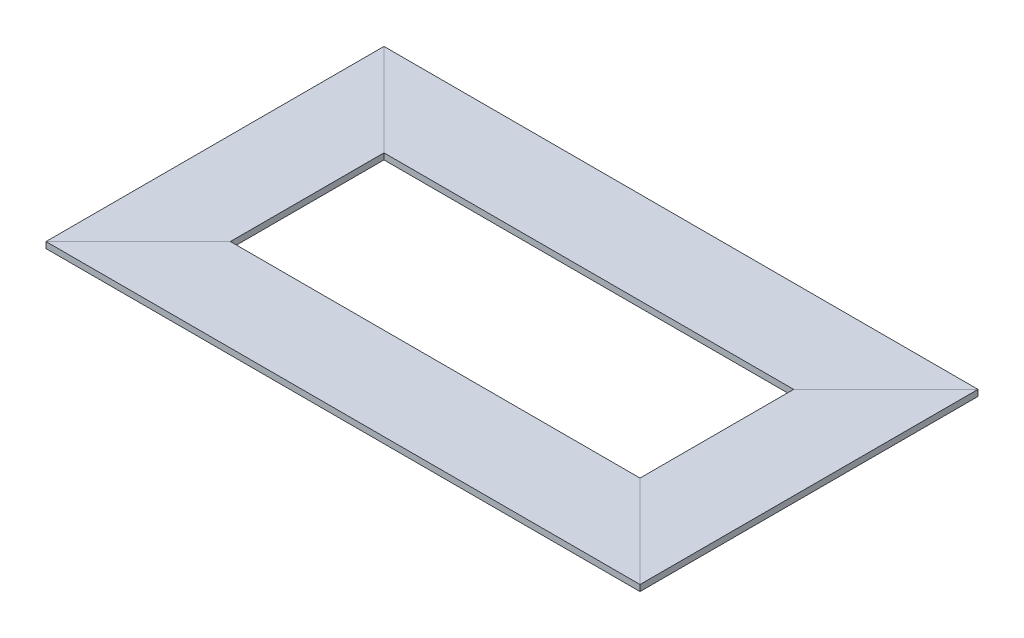
ISO-10303-21;
HEADER;
FILE_DESCRIPTION(('STEP AP214'),'2;1');
FILE_NAME('part.step','',(''),(''),'','','');
FILE_SCHEMA(('AUTOMOTIVE_DESIGN { 1 0 10303 214 1 1 1 1 }'));
ENDSEC;
DATA;
#1=APPLICATION_CONTEXT('core data for automotive mechanical design processes');
#2=APPLICATION_PROTOCOL_DEFINITION('international standard','automotive_design',2000,#1);
#3=PRODUCT_CONTEXT('',#1,'mechanical');
#4=PRODUCT('Part','Part','',(#3));
#5=PRODUCT_RELATED_PRODUCT_CATEGORY('part','',(#4));
#6=PRODUCT_DEFINITION_FORMATION('','',#4);
#7=PRODUCT_DEFINITION_CONTEXT('part definition',#1,'design');
#8=PRODUCT_DEFINITION('design','',#6,#7);
#9=PRODUCT_DEFINITION_SHAPE('','',#8);
#10=(LENGTH_UNIT() NAMED_UNIT(*) SI_UNIT(.MILLI.,.METRE.));
#11=(NAMED_UNIT(*) PLANE_ANGLE_UNIT() SI_UNIT($,.RADIAN.));
#12=(NAMED_UNIT(*) SI_UNIT($,.STERADIAN.) SOLID_ANGLE_UNIT());
#13=UNCERTAINTY_MEASURE_WITH_UNIT(LENGTH_MEASURE(1.E-05),#10,'distance_accuracy_value','');
#14=(GEOMETRIC_REPRESENTATION_CONTEXT(3) GLOBAL_UNCERTAINTY_ASSIGNED_CONTEXT((#13)) GLOBAL_UNIT_ASSIGNED_CONTEXT((#10,
#11,#12)) REPRESENTATION_CONTEXT('',''));
#15=CARTESIAN_POINT('',(0.,0.,0.));
#16=DIRECTION('',(0.,0.,1.));
#17=DIRECTION('',(1.,0.,0.));
#18=AXIS2_PLACEMENT_3D('',#15,#16,#17);
#19=CARTESIAN_POINT('',(98.,0.71296145830337,-49.9));
#20=DIRECTION('',(0.,1.,0.));
#21=DIRECTION('',(-1.,0.,0.));
#22=AXIS2_PLACEMENT_3D('',#19,#20,#21);
#23=PLANE('',#22);
#24=DIRECTION('',(0.,0.,1.));
#25=VECTOR('',#24,1.);
#26=CARTESIAN_POINT('',(93.3642700046298,0.71296145830337,-49.9));
#27=LINE('',#26,#25);
#28=CARTESIAN_POINT('',(93.3642700046298,0.71296145830337,-43.3642700046298));
#29=VERTEX_POINT('',#28);
#30=CARTESIAN_POINT('',(93.3642700046298,0.71296145830337,13.3642700046298));
#31=VERTEX_POINT('',#30);
#32=EDGE_CURVE('E45',#29,#31,#27,.T.);
#33=ORIENTED_EDGE('',*,*,#32,.F.);
#34=DIRECTION('',(0.707106781186547,0.,-0.707106781186548));
#35=VECTOR('',#34,1.);
#36=CARTESIAN_POINT('',(39.05,0.712961458303368,10.95));
#37=LINE('',#36,#35);
#38=CARTESIAN_POINT('',(98.,0.71296145830337,-48.));
#39=VERTEX_POINT('',#38);
#40=EDGE_CURVE('E216',#29,#39,#37,.T.);
#41=ORIENTED_EDGE('',*,*,#40,.T.);
#42=DIRECTION('',(0.,0.,1.));
#43=VECTOR('',#42,1.);
#44=CARTESIAN_POINT('',(98.,0.71296145830337,-49.9));
#45=LINE('',#44,#43);
#46=CARTESIAN_POINT('',(98.,0.71296145830337,18.));
#47=VERTEX_POINT('',#46);
#48=EDGE_CURVE('E146',#39,#47,#45,.T.);
#49=ORIENTED_EDGE('',*,*,#48,.T.);
#50=DIRECTION('',(0.707106781186548,0.,0.707106781186547));
#51=VECTOR('',#50,1.);
#52=CARTESIAN_POINT('',(98.95,0.71296145830337,18.95));
#53=LINE('',#52,#51);
#54=EDGE_CURVE('E133',#31,#47,#53,.T.);
#55=ORIENTED_EDGE('',*,*,#54,.F.);
#56=EDGE_LOOP('',(#33,#41,#49,#55));
#57=FACE_BOUND('',#56,.T.);
#58=ADVANCED_FACE('F39',(#57),#23,.F.);
#59=CARTESIAN_POINT('',(98.,1.91296145830337,-49.9));
#60=DIRECTION('',(-1.,0.,0.));
#61=DIRECTION('',(0.,0.,1.));
#62=AXIS2_PLACEMENT_3D('',#59,#60,#61);
#63=PLANE('',#62);
#64=ORIENTED_EDGE('',*,*,#48,.F.);
#65=DIRECTION('',(0.,1.,0.));
#66=VECTOR('',#65,1.);
#67=CARTESIAN_POINT('',(98.,1.91296145830337,-48.));
#68=LINE('',#67,#66);
#69=CARTESIAN_POINT('',(98.,1.91296145830337,-48.));
#70=VERTEX_POINT('',#69);
#71=EDGE_CURVE('E288',#39,#70,#68,.T.);
#72=ORIENTED_EDGE('',*,*,#71,.T.);
#73=DIRECTION('',(0.,0.,1.));
#74=VECTOR('',#73,1.);
#75=CARTESIAN_POINT('',(98.,1.91296145830337,-49.9));
#76=LINE('',#75,#74);
#77=CARTESIAN_POINT('',(98.,1.91296145830337,18.));
#78=VERTEX_POINT('',#77);
#79=EDGE_CURVE('E169',#70,#78,#76,.T.);
#80=ORIENTED_EDGE('',*,*,#79,.T.);
#81=DIRECTION('',(0.,1.,0.));
#82=VECTOR('',#81,1.);
#83=CARTESIAN_POINT('',(98.,1.91296145830337,18.));
#84=LINE('',#83,#82);
#85=EDGE_CURVE('E155',#47,#78,#84,.T.);
#86=ORIENTED_EDGE('',*,*,#85,.F.);
#87=EDGE_LOOP('',(#64,#72,#80,#86));
#88=FACE_BOUND('',#87,.T.);
#89=ADVANCED_FACE('F422',(#88),#63,.F.);
#90=CARTESIAN_POINT('',(98.,1.91296145830337,-49.9));
#91=DIRECTION('',(0.,-1.,0.));
#92=DIRECTION('',(0.,0.,-1.));
#93=AXIS2_PLACEMENT_3D('',#90,#91,#92);
#94=PLANE('',#93);
#95=ORIENTED_EDGE('',*,*,#79,.F.);
#96=DIRECTION('',(-0.707106781186547,0.,0.707106781186548));
#97=VECTOR('',#96,1.);
#98=CARTESIAN_POINT('',(39.05,1.91296145830337,10.95));
#99=LINE('',#98,#97);
#100=CARTESIAN_POINT('',(80.,1.91296145830337,-30.));
#101=VERTEX_POINT('',#100);
#102=EDGE_CURVE('E286',#70,#101,#99,.T.);
#103=ORIENTED_EDGE('',*,*,#102,.T.);
#104=DIRECTION('',(0.,0.,1.));
#105=VECTOR('',#104,1.);
#106=CARTESIAN_POINT('',(80.,1.91296145830337,-49.9));
#107=LINE('',#106,#105);
#108=CARTESIAN_POINT('',(80.,1.91296145830337,0.));
#109=VERTEX_POINT('',#108);
#110=EDGE_CURVE('E172',#101,#109,#107,.T.);
#111=ORIENTED_EDGE('',*,*,#110,.T.);
#112=DIRECTION('',(-0.707106781186548,0.,-0.707106781186547));
#113=VECTOR('',#112,1.);
#114=CARTESIAN_POINT('',(98.95,1.91296145830337,18.95));
#115=LINE('',#114,#113);
#116=EDGE_CURVE('E227',#78,#109,#115,.T.);
#117=ORIENTED_EDGE('',*,*,#116,.F.);
#118=EDGE_LOOP('',(#95,#103,#111,#117));
#119=FACE_BOUND('',#118,.T.);
#120=ADVANCED_FACE('F421',(#119),#94,.F.);
#121=CARTESIAN_POINT('',(80.,1.91296145830337,-49.9));
#122=DIRECTION('',(1.,0.,0.));
#123=DIRECTION('',(0.,0.,-1.));
#124=AXIS2_PLACEMENT_3D('',#121,#122,#123);
#125=PLANE('',#124);
#126=ORIENTED_EDGE('',*,*,#110,.F.);
#127=DIRECTION('',(0.,-1.,0.));
#128=VECTOR('',#127,1.);
#129=CARTESIAN_POINT('',(80.,1.91296145830336,-30.));
#130=LINE('',#129,#128);
#131=CARTESIAN_POINT('',(80.,0.71296145830337,-30.));
#132=VERTEX_POINT('',#131);
#133=EDGE_CURVE('E284',#101,#132,#130,.T.);
#134=ORIENTED_EDGE('',*,*,#133,.T.);
#135=DIRECTION('',(0.,0.,1.));
#136=VECTOR('',#135,1.);
#137=CARTESIAN_POINT('',(80.,0.71296145830337,-49.9));
#138=LINE('',#137,#136);
#139=CARTESIAN_POINT('',(80.,0.71296145830337,0.));
#140=VERTEX_POINT('',#139);
#141=EDGE_CURVE('E171',#132,#140,#138,.T.);
#142=ORIENTED_EDGE('',*,*,#141,.T.);
#143=DIRECTION('',(0.,-1.,0.));
#144=VECTOR('',#143,1.);
#145=CARTESIAN_POINT('',(80.,1.91296145830337,0.));
#146=LINE('',#145,#144);
#147=EDGE_CURVE('E221',#109,#140,#146,.T.);
#148=ORIENTED_EDGE('',*,*,#147,.F.);
#149=EDGE_LOOP('',(#126,#134,#142,#148));
#150=FACE_BOUND('',#149,.T.);
#151=ADVANCED_FACE('F431',(#150),#125,.F.);
#152=CARTESIAN_POINT('',(80.,0.71296145830337,-49.9));
#153=DIRECTION('',(0.,1.,0.));
#154=DIRECTION('',(0.,0.,1.));
#155=AXIS2_PLACEMENT_3D('',#152,#153,#154);
#156=PLANE('',#155);
#157=ORIENTED_EDGE('',*,*,#141,.F.);
#158=DIRECTION('',(0.707106781186547,0.,-0.707106781186548));
#159=VECTOR('',#158,1.);
#160=CARTESIAN_POINT('',(30.05,0.71296145830337,19.95));
#161=LINE('',#160,#159);
#162=CARTESIAN_POINT('',(83.8572987406945,0.71296145830337,-33.8572987406945));
#163=VERTEX_POINT('',#162);
#164=EDGE_CURVE('E278',#132,#163,#161,.T.);
#165=ORIENTED_EDGE('',*,*,#164,.T.);
#166=DIRECTION('',(0.,0.,1.));
#167=VECTOR('',#166,1.);
#168=CARTESIAN_POINT('',(83.8572987406945,0.71296145830337,-49.9));
#169=LINE('',#168,#167);
#170=CARTESIAN_POINT('',(83.8572987406945,0.71296145830337,3.85729874069453));
#171=VERTEX_POINT('',#170);
#172=EDGE_CURVE('E177',#163,#171,#169,.T.);
#173=ORIENTED_EDGE('',*,*,#172,.T.);
#174=DIRECTION('',(0.707106781186548,0.,0.707106781186547));
#175=VECTOR('',#174,1.);
#176=CARTESIAN_POINT('',(89.95,0.71296145830337,9.95000000000002));
#177=LINE('',#176,#175);
#178=EDGE_CURVE('E225',#140,#171,#177,.T.);
#179=ORIENTED_EDGE('',*,*,#178,.F.);
#180=EDGE_LOOP('',(#157,#165,#173,#179));
#181=FACE_BOUND('',#180,.T.);
#182=ADVANCED_FACE('F505',(#181),#156,.F.);
#183=CARTESIAN_POINT('',(87.,0.712961458303367,-49.9));
#184=DIRECTION('',(0.,1.,0.));
#185=DIRECTION('',(-1.,0.,0.));
#186=AXIS2_PLACEMENT_3D('',#183,#184,#185);
#187=PLANE('',#186);
#188=ORIENTED_EDGE('',*,*,#172,.F.);
#189=DIRECTION('',(0.707106781186547,0.,-0.707106781186548));
#190=VECTOR('',#189,1.);
#191=CARTESIAN_POINT('',(33.55,0.71296145830341,16.45));
#192=LINE('',#191,#190);
#193=CARTESIAN_POINT('',(87.,0.712961458303367,-37.));
#194=VERTEX_POINT('',#193);
#195=EDGE_CURVE('E280',#163,#194,#192,.T.);
#196=ORIENTED_EDGE('',*,*,#195,.T.);
#197=DIRECTION('',(0.,0.,1.));
#198=VECTOR('',#197,1.);
#199=CARTESIAN_POINT('',(87.,0.712961458303367,-49.9));
#200=LINE('',#199,#198);
#201=CARTESIAN_POINT('',(87.,0.712961458303367,7.));
#202=VERTEX_POINT('',#201);
#203=EDGE_CURVE('E180',#194,#202,#200,.T.);
#204=ORIENTED_EDGE('',*,*,#203,.T.);
#205=DIRECTION('',(0.707106781186548,0.,0.707106781186547));
#206=VECTOR('',#205,1.);
#207=CARTESIAN_POINT('',(93.45,0.712961458303362,13.45));
#208=LINE('',#207,#206);
#209=EDGE_CURVE('E219',#171,#202,#208,.T.);
#210=ORIENTED_EDGE('',*,*,#209,.F.);
#211=EDGE_LOOP('',(#188,#196,#204,#210));
#212=FACE_BOUND('',#211,.T.);
#213=ADVANCED_FACE('F499',(#212),#187,.F.);
#214=CARTESIAN_POINT('',(87.,-2.28703854169663,-49.9));
#215=DIRECTION('',(1.,0.,0.));
#216=DIRECTION('',(0.,0.,-1.));
#217=AXIS2_PLACEMENT_3D('',#214,#215,#216);
#218=PLANE('',#217);
#219=ORIENTED_EDGE('',*,*,#203,.F.);
#220=DIRECTION('',(0.,-1.,0.));
#221=VECTOR('',#220,1.);
#222=CARTESIAN_POINT('',(87.,-2.28703854169663,-37.));
#223=LINE('',#222,#221);
#224=CARTESIAN_POINT('',(87.,-2.28703854169663,-37.));
#225=VERTEX_POINT('',#224);
#226=EDGE_CURVE('E197',#194,#225,#223,.T.);
#227=ORIENTED_EDGE('',*,*,#226,.T.);
#228=DIRECTION('',(0.,0.,1.));
#229=VECTOR('',#228,1.);
#230=CARTESIAN_POINT('',(87.,-2.28703854169663,-49.9));
#231=LINE('',#230,#229);
#232=CARTESIAN_POINT('',(87.,-2.28703854169663,7.));
#233=VERTEX_POINT('',#232);
#234=EDGE_CURVE('E181',#225,#233,#231,.T.);
#235=ORIENTED_EDGE('',*,*,#234,.T.);
#236=DIRECTION('',(0.,-1.,0.));
#237=VECTOR('',#236,1.);
#238=CARTESIAN_POINT('',(87.,-2.28703854169663,7.));
#239=LINE('',#238,#237);
#240=EDGE_CURVE('E120',#202,#233,#239,.T.);
#241=ORIENTED_EDGE('',*,*,#240,.F.);
#242=EDGE_LOOP('',(#219,#227,#235,#241));
#243=FACE_BOUND('',#242,.T.);
#244=ADVANCED_FACE('F494',(#243),#218,.F.);
#245=CARTESIAN_POINT('',(93.3642700046298,-2.28703854169663,-49.9));
#246=DIRECTION('',(0.,1.,0.));
#247=DIRECTION('',(0.,0.,1.));
#248=AXIS2_PLACEMENT_3D('',#245,#246,#247);
#249=PLANE('',#248);
#250=ORIENTED_EDGE('',*,*,#234,.F.);
#251=DIRECTION('',(0.707106781186547,0.,-0.707106781186548));
#252=VECTOR('',#251,1.);
#253=CARTESIAN_POINT('',(36.7321350023149,-2.28703854169663,13.2678649976851));
#254=LINE('',#253,#252);
#255=CARTESIAN_POINT('',(93.3642700046298,-2.28703854169663,-43.3642700046298));
#256=VERTEX_POINT('',#255);
#257=EDGE_CURVE('E192',#225,#256,#254,.T.);
#258=ORIENTED_EDGE('',*,*,#257,.T.);
#259=DIRECTION('',(0.,0.,1.));
#260=VECTOR('',#259,1.);
#261=CARTESIAN_POINT('',(93.3642700046298,-2.28703854169663,-49.9));
#262=LINE('',#261,#260);
#263=CARTESIAN_POINT('',(93.3642700046298,-2.28703854169663,13.3642700046298));
#264=VERTEX_POINT('',#263);
#265=EDGE_CURVE('E144',#256,#264,#262,.T.);
#266=ORIENTED_EDGE('',*,*,#265,.T.);
#267=DIRECTION('',(0.707106781186548,0.,0.707106781186547));
#268=VECTOR('',#267,1.);
#269=CARTESIAN_POINT('',(96.632135002315,-2.28703854169663,16.6321350023149));
#270=LINE('',#269,#268);
#271=EDGE_CURVE('E188',#233,#264,#270,.T.);
#272=ORIENTED_EDGE('',*,*,#271,.F.);
#273=EDGE_LOOP('',(#250,#258,#266,#272));
#274=FACE_BOUND('',#273,.T.);
#275=ADVANCED_FACE('F186',(#274),#249,.F.);
#276=CARTESIAN_POINT('',(93.3642700046298,0.71296145830337,-49.9));
#277=DIRECTION('',(-1.,0.,0.));
#278=DIRECTION('',(0.,-1.,0.));
#279=AXIS2_PLACEMENT_3D('',#276,#277,#278);
#280=PLANE('',#279);
#281=ORIENTED_EDGE('',*,*,#265,.F.);
#282=DIRECTION('',(0.,1.,0.));
#283=VECTOR('',#282,1.);
#284=CARTESIAN_POINT('',(93.3642700046298,0.712961458303304,-43.3642700046298));
#285=LINE('',#284,#283);
#286=EDGE_CURVE('E143',#256,#29,#285,.T.);
#287=ORIENTED_EDGE('',*,*,#286,.T.);
#288=ORIENTED_EDGE('',*,*,#32,.T.);
#289=DIRECTION('',(0.,1.,0.));
#290=VECTOR('',#289,1.);
#291=CARTESIAN_POINT('',(93.3642700046298,0.712961458303374,13.3642700046298));
#292=LINE('',#291,#290);
#293=EDGE_CURVE('E123',#264,#31,#292,.T.);
#294=ORIENTED_EDGE('',*,*,#293,.F.);
#295=EDGE_LOOP('',(#281,#287,#288,#294));
#296=FACE_BOUND('',#295,.T.);
#297=ADVANCED_FACE('F140',(#296),#280,.F.);
#298=CARTESIAN_POINT('',(99.9,0.71296145830337,18.));
#299=DIRECTION('',(0.,1.,0.));
#300=DIRECTION('',(0.,0.,1.));
#301=AXIS2_PLACEMENT_3D('',#298,#299,#300);
#302=PLANE('',#301);
#303=DIRECTION('',(-1.,0.,0.));
#304=VECTOR('',#303,1.);
#305=CARTESIAN_POINT('',(99.9,0.71296145830337,13.3642700046298));
#306=LINE('',#305,#304);
#307=CARTESIAN_POINT('',(-13.3642700046298,0.71296145830337,13.3642700046298));
#308=VERTEX_POINT('',#307);
#309=EDGE_CURVE('E129',#31,#308,#306,.T.);
#310=ORIENTED_EDGE('',*,*,#309,.F.);
#311=ORIENTED_EDGE('',*,*,#54,.T.);
#312=DIRECTION('',(-1.,0.,0.));
#313=VECTOR('',#312,1.);
#314=CARTESIAN_POINT('',(99.9,0.71296145830337,18.));
#315=LINE('',#314,#313);
#316=CARTESIAN_POINT('',(-18.,0.71296145830337,18.));
#317=VERTEX_POINT('',#316);
#318=EDGE_CURVE('E217',#47,#317,#315,.T.);
#319=ORIENTED_EDGE('',*,*,#318,.T.);
#320=DIRECTION('',(-0.707106781186547,0.,0.707106781186548));
#321=VECTOR('',#320,1.);
#322=CARTESIAN_POINT('',(-18.95,0.71296145830337,18.95));
#323=LINE('',#322,#321);
#324=EDGE_CURVE('E156',#308,#317,#323,.T.);
#325=ORIENTED_EDGE('',*,*,#324,.F.);
#326=EDGE_LOOP('',(#310,#311,#319,#325));
#327=FACE_BOUND('',#326,.T.);
#328=ADVANCED_FACE('F152',(#327),#302,.F.);
#329=CARTESIAN_POINT('',(99.9,1.91296145830337,18.));
#330=DIRECTION('',(0.,0.,-1.));
#331=DIRECTION('',(-1.,0.,0.));
#332=AXIS2_PLACEMENT_3D('',#329,#330,#331);
#333=PLANE('',#332);
#334=ORIENTED_EDGE('',*,*,#318,.F.);
#335=ORIENTED_EDGE('',*,*,#85,.T.);
#336=DIRECTION('',(-1.,0.,0.));
#337=VECTOR('',#336,1.);
#338=CARTESIAN_POINT('',(99.9,1.91296145830337,18.));
#339=LINE('',#338,#337);
#340=CARTESIAN_POINT('',(-18.,1.91296145830337,18.));
#341=VERTEX_POINT('',#340);
#342=EDGE_CURVE('E228',#78,#341,#339,.T.);
#343=ORIENTED_EDGE('',*,*,#342,.T.);
#344=DIRECTION('',(0.,1.,0.));
#345=VECTOR('',#344,1.);
#346=CARTESIAN_POINT('',(-18.,1.91296145830337,18.));
#347=LINE('',#346,#345);
#348=EDGE_CURVE('E397',#317,#341,#347,.T.);
#349=ORIENTED_EDGE('',*,*,#348,.F.);
#350=EDGE_LOOP('',(#334,#335,#343,#349));
#351=FACE_BOUND('',#350,.T.);
#352=ADVANCED_FACE('F401',(#351),#333,.F.);
#353=CARTESIAN_POINT('',(99.9,1.91296145830337,18.));
#354=DIRECTION('',(0.,-1.,0.));
#355=DIRECTION('',(0.,0.,-1.));
#356=AXIS2_PLACEMENT_3D('',#353,#354,#355);
#357=PLANE('',#356);
#358=ORIENTED_EDGE('',*,*,#342,.F.);
#359=ORIENTED_EDGE('',*,*,#116,.T.);
#360=DIRECTION('',(-1.,0.,0.));
#361=VECTOR('',#360,1.);
#362=CARTESIAN_POINT('',(99.9000000000001,1.91296145830337,0.));
#363=LINE('',#362,#361);
#364=CARTESIAN_POINT('',(0.,1.91296145830337,0.));
#365=VERTEX_POINT('',#364);
#366=EDGE_CURVE('E234',#109,#365,#363,.T.);
#367=ORIENTED_EDGE('',*,*,#366,.T.);
#368=DIRECTION('',(0.707106781186547,0.,-0.707106781186548));
#369=VECTOR('',#368,1.);
#370=CARTESIAN_POINT('',(-18.95,1.91296145830337,18.95));
#371=LINE('',#370,#369);
#372=EDGE_CURVE('E400',#341,#365,#371,.T.);
#373=ORIENTED_EDGE('',*,*,#372,.F.);
#374=EDGE_LOOP('',(#358,#359,#367,#373));
#375=FACE_BOUND('',#374,.T.);
#376=ADVANCED_FACE('F403',(#375),#357,.F.);
#377=CARTESIAN_POINT('',(99.9000000000001,1.91296145830337,0.));
#378=DIRECTION('',(0.,0.,1.));
#379=DIRECTION('',(0.,-1.,0.));
#380=AXIS2_PLACEMENT_3D('',#377,#378,#379);
#381=PLANE('',#380);
#382=ORIENTED_EDGE('',*,*,#366,.F.);
#383=ORIENTED_EDGE('',*,*,#147,.T.);
#384=DIRECTION('',(-1.,0.,0.));
#385=VECTOR('',#384,1.);
#386=CARTESIAN_POINT('',(99.9000000000001,0.71296145830337,0.));
#387=LINE('',#386,#385);
#388=CARTESIAN_POINT('',(0.,0.71296145830337,0.));
#389=VERTEX_POINT('',#388);
#390=EDGE_CURVE('E237',#140,#389,#387,.T.);
#391=ORIENTED_EDGE('',*,*,#390,.T.);
#392=DIRECTION('',(0.,-1.,0.));
#393=VECTOR('',#392,1.);
#394=CARTESIAN_POINT('',(0.,1.91296145830337,0.));
#395=LINE('',#394,#393);
#396=EDGE_CURVE('E406',#365,#389,#395,.T.);
#397=ORIENTED_EDGE('',*,*,#396,.F.);
#398=EDGE_LOOP('',(#382,#383,#391,#397));
#399=FACE_BOUND('',#398,.T.);
#400=ADVANCED_FACE('F477',(#399),#381,.F.);
#401=CARTESIAN_POINT('',(99.9000000000001,0.71296145830337,0.));
#402=DIRECTION('',(0.,1.,0.));
#403=DIRECTION('',(0.,0.,1.));
#404=AXIS2_PLACEMENT_3D('',#401,#402,#403);
#405=PLANE('',#404);
#406=ORIENTED_EDGE('',*,*,#390,.F.);
#407=ORIENTED_EDGE('',*,*,#178,.T.);
#408=DIRECTION('',(-1.,0.,0.));
#409=VECTOR('',#408,1.);
#410=CARTESIAN_POINT('',(99.9000000000001,0.71296145830337,3.85729874069453));
#411=LINE('',#410,#409);
#412=CARTESIAN_POINT('',(-3.85729874069453,0.71296145830337,3.85729874069453));
#413=VERTEX_POINT('',#412);
#414=EDGE_CURVE('E239',#171,#413,#411,.T.);
#415=ORIENTED_EDGE('',*,*,#414,.T.);
#416=DIRECTION('',(-0.707106781186547,0.,0.707106781186548));
#417=VECTOR('',#416,1.);
#418=CARTESIAN_POINT('',(-9.94999999999999,0.71296145830337,9.95));
#419=LINE('',#418,#417);
#420=EDGE_CURVE('E379',#389,#413,#419,.T.);
#421=ORIENTED_EDGE('',*,*,#420,.F.);
#422=EDGE_LOOP('',(#406,#407,#415,#421));
#423=FACE_BOUND('',#422,.T.);
#424=ADVANCED_FACE('F478',(#423),#405,.F.);
#425=CARTESIAN_POINT('',(99.9,0.712961458303367,7.));
#426=DIRECTION('',(0.,1.,0.));
#427=DIRECTION('',(0.,0.,1.));
#428=AXIS2_PLACEMENT_3D('',#425,#426,#427);
#429=PLANE('',#428);
#430=ORIENTED_EDGE('',*,*,#414,.F.);
#431=ORIENTED_EDGE('',*,*,#209,.T.);
#432=DIRECTION('',(-1.,0.,0.));
#433=VECTOR('',#432,1.);
#434=CARTESIAN_POINT('',(99.9,0.712961458303367,7.));
#435=LINE('',#434,#433);
#436=CARTESIAN_POINT('',(-6.99999999999999,0.712961458303367,7.));
#437=VERTEX_POINT('',#436);
#438=EDGE_CURVE('E245',#202,#437,#435,.T.);
#439=ORIENTED_EDGE('',*,*,#438,.T.);
#440=DIRECTION('',(-0.707106781186547,0.,0.707106781186548));
#441=VECTOR('',#440,1.);
#442=CARTESIAN_POINT('',(-13.45,0.712961458303362,13.45));
#443=LINE('',#442,#441);
#444=EDGE_CURVE('E384',#413,#437,#443,.T.);
#445=ORIENTED_EDGE('',*,*,#444,.F.);
#446=EDGE_LOOP('',(#430,#431,#439,#445));
#447=FACE_BOUND('',#446,.T.);
#448=ADVANCED_FACE('F471',(#447),#429,.F.);
#449=CARTESIAN_POINT('',(99.9,-2.28703854169663,7.));
#450=DIRECTION('',(0.,0.,1.));
#451=DIRECTION('',(1.,0.,0.));
#452=AXIS2_PLACEMENT_3D('',#449,#450,#451);
#453=PLANE('',#452);
#454=ORIENTED_EDGE('',*,*,#438,.F.);
#455=ORIENTED_EDGE('',*,*,#240,.T.);
#456=DIRECTION('',(-1.,0.,0.));
#457=VECTOR('',#456,1.);
#458=CARTESIAN_POINT('',(99.9,-2.28703854169663,7.));
#459=LINE('',#458,#457);
#460=CARTESIAN_POINT('',(-6.99999999999999,-2.28703854169663,7.));
#461=VERTEX_POINT('',#460);
#462=EDGE_CURVE('E162',#233,#461,#459,.T.);
#463=ORIENTED_EDGE('',*,*,#462,.T.);
#464=DIRECTION('',(0.,-1.,0.));
#465=VECTOR('',#464,1.);
#466=CARTESIAN_POINT('',(-6.99999999999999,-2.28703854169663,7.));
#467=LINE('',#466,#465);
#468=EDGE_CURVE('E250',#437,#461,#467,.T.);
#469=ORIENTED_EDGE('',*,*,#468,.F.);
#470=EDGE_LOOP('',(#454,#455,#463,#469));
#471=FACE_BOUND('',#470,.T.);
#472=ADVANCED_FACE('F247',(#471),#453,.F.);
#473=CARTESIAN_POINT('',(99.9,-2.28703854169663,13.3642700046298));
#474=DIRECTION('',(0.,1.,0.));
#475=DIRECTION('',(0.,0.,1.));
#476=AXIS2_PLACEMENT_3D('',#473,#474,#475);
#477=PLANE('',#476);
#478=ORIENTED_EDGE('',*,*,#462,.F.);
#479=ORIENTED_EDGE('',*,*,#271,.T.);
#480=DIRECTION('',(-1.,0.,0.));
#481=VECTOR('',#480,1.);
#482=CARTESIAN_POINT('',(99.9,-2.28703854169663,13.3642700046298));
#483=LINE('',#482,#481);
#484=CARTESIAN_POINT('',(-13.3642700046298,-2.28703854169663,13.3642700046298));
#485=VERTEX_POINT('',#484);
#486=EDGE_CURVE('E135',#264,#485,#483,.T.);
#487=ORIENTED_EDGE('',*,*,#486,.T.);
#488=DIRECTION('',(-0.707106781186547,0.,0.707106781186548));
#489=VECTOR('',#488,1.);
#490=CARTESIAN_POINT('',(-16.6321350023149,-2.28703854169663,16.6321350023149));
#491=LINE('',#490,#489);
#492=EDGE_CURVE('E258',#461,#485,#491,.T.);
#493=ORIENTED_EDGE('',*,*,#492,.F.);
#494=EDGE_LOOP('',(#478,#479,#487,#493));
#495=FACE_BOUND('',#494,.T.);
#496=ADVANCED_FACE('F256',(#495),#477,.F.);
#497=CARTESIAN_POINT('',(99.9,0.71296145830337,13.3642700046298));
#498=DIRECTION('',(0.,0.,-1.));
#499=DIRECTION('',(0.,1.,0.));
#500=AXIS2_PLACEMENT_3D('',#497,#498,#499);
#501=PLANE('',#500);
#502=ORIENTED_EDGE('',*,*,#486,.F.);
#503=ORIENTED_EDGE('',*,*,#293,.T.);
#504=ORIENTED_EDGE('',*,*,#309,.T.);
#505=DIRECTION('',(0.,1.,0.));
#506=VECTOR('',#505,1.);
#507=CARTESIAN_POINT('',(-13.3642700046298,0.712961458303374,13.3642700046298));
#508=LINE('',#507,#506);
#509=EDGE_CURVE('E257',#485,#308,#508,.T.);
#510=ORIENTED_EDGE('',*,*,#509,.F.);
#511=EDGE_LOOP('',(#502,#503,#504,#510));
#512=FACE_BOUND('',#511,.T.);
#513=ADVANCED_FACE('F127',(#512),#501,.F.);
#514=CARTESIAN_POINT('',(-19.9000000000001,0.71296145830337,-48.));
#515=DIRECTION('',(0.,1.,0.));
#516=DIRECTION('',(0.,0.,1.));
#517=AXIS2_PLACEMENT_3D('',#514,#515,#516);
#518=PLANE('',#517);
#519=DIRECTION('',(1.,0.,0.));
#520=VECTOR('',#519,1.);
#521=CARTESIAN_POINT('',(-19.9000000000001,0.71296145830337,-43.3642700046298));
#522=LINE('',#521,#520);
#523=CARTESIAN_POINT('',(-13.3642700046299,0.71296145830337,-43.3642700046298));
#524=VERTEX_POINT('',#523);
#525=EDGE_CURVE('E206',#524,#29,#522,.T.);
#526=ORIENTED_EDGE('',*,*,#525,.F.);
#527=DIRECTION('',(-0.707106781186548,0.,-0.707106781186547));
#528=VECTOR('',#527,1.);
#529=CARTESIAN_POINT('',(15.95,0.712961458303369,-14.05));
#530=LINE('',#529,#528);
#531=CARTESIAN_POINT('',(-18.0000000000001,0.71296145830337,-48.));
#532=VERTEX_POINT('',#531);
#533=EDGE_CURVE('E350',#524,#532,#530,.T.);
#534=ORIENTED_EDGE('',*,*,#533,.T.);
#535=DIRECTION('',(1.,0.,0.));
#536=VECTOR('',#535,1.);
#537=CARTESIAN_POINT('',(-19.9000000000001,0.71296145830337,-48.));
#538=LINE('',#537,#536);
#539=EDGE_CURVE('E158',#532,#39,#538,.T.);
#540=ORIENTED_EDGE('',*,*,#539,.T.);
#541=ORIENTED_EDGE('',*,*,#40,.F.);
#542=EDGE_LOOP('',(#526,#534,#540,#541));
#543=FACE_BOUND('',#542,.T.);
#544=ADVANCED_FACE('F351',(#543),#518,.F.);
#545=CARTESIAN_POINT('',(-19.9000000000001,1.91296145830337,-48.));
#546=DIRECTION('',(0.,0.,1.));
#547=DIRECTION('',(1.,0.,0.));
#548=AXIS2_PLACEMENT_3D('',#545,#546,#547);
#549=PLANE('',#548);
#550=ORIENTED_EDGE('',*,*,#539,.F.);
#551=DIRECTION('',(0.,1.,0.));
#552=VECTOR('',#551,1.);
#553=CARTESIAN_POINT('',(-18.0000000000001,1.91296145830337,-48.));
#554=LINE('',#553,#552);
#555=CARTESIAN_POINT('',(-18.0000000000001,1.91296145830337,-48.));
#556=VERTEX_POINT('',#555);
#557=EDGE_CURVE('E339',#532,#556,#554,.T.);
#558=ORIENTED_EDGE('',*,*,#557,.T.);
#559=DIRECTION('',(1.,0.,0.));
#560=VECTOR('',#559,1.);
#561=CARTESIAN_POINT('',(-19.9000000000001,1.91296145830337,-48.));
#562=LINE('',#561,#560);
#563=EDGE_CURVE('E161',#556,#70,#562,.T.);
#564=ORIENTED_EDGE('',*,*,#563,.T.);
#565=ORIENTED_EDGE('',*,*,#71,.F.);
#566=EDGE_LOOP('',(#550,#558,#564,#565));
#567=FACE_BOUND('',#566,.T.);
#568=ADVANCED_FACE('F352',(#567),#549,.F.);
#569=CARTESIAN_POINT('',(-19.9000000000001,1.91296145830337,-48.));
#570=DIRECTION('',(0.,-1.,0.));
#571=DIRECTION('',(0.,0.,-1.));
#572=AXIS2_PLACEMENT_3D('',#569,#570,#571);
#573=PLANE('',#572);
#574=ORIENTED_EDGE('',*,*,#563,.F.);
#575=DIRECTION('',(0.707106781186548,0.,0.707106781186547));
#576=VECTOR('',#575,1.);
#577=CARTESIAN_POINT('',(15.95,1.91296145830337,-14.05));
#578=LINE('',#577,#576);
#579=CARTESIAN_POINT('',(0.,1.91296145830337,-30.));
#580=VERTEX_POINT('',#579);
#581=EDGE_CURVE('E346',#556,#580,#578,.T.);
#582=ORIENTED_EDGE('',*,*,#581,.T.);
#583=DIRECTION('',(1.,0.,0.));
#584=VECTOR('',#583,1.);
#585=CARTESIAN_POINT('',(-19.9000000000001,1.91296145830337,-30.));
#586=LINE('',#585,#584);
#587=EDGE_CURVE('E293',#580,#101,#586,.T.);
#588=ORIENTED_EDGE('',*,*,#587,.T.);
#589=ORIENTED_EDGE('',*,*,#102,.F.);
#590=EDGE_LOOP('',(#574,#582,#588,#589));
#591=FACE_BOUND('',#590,.T.);
#592=ADVANCED_FACE('F416',(#591),#573,.F.);
#593=CARTESIAN_POINT('',(-19.9000000000001,1.91296145830337,-30.));
#594=DIRECTION('',(0.,0.,-1.));
#595=DIRECTION('',(-1.,0.,0.));
#596=AXIS2_PLACEMENT_3D('',#593,#594,#595);
#597=PLANE('',#596);
#598=ORIENTED_EDGE('',*,*,#587,.F.);
#599=DIRECTION('',(0.,-1.,0.));
#600=VECTOR('',#599,1.);
#601=CARTESIAN_POINT('',(0.,1.91296145830337,-30.));
#602=LINE('',#601,#600);
#603=CARTESIAN_POINT('',(0.,0.71296145830337,-30.));
#604=VERTEX_POINT('',#603);
#605=EDGE_CURVE('E418',#580,#604,#602,.T.);
#606=ORIENTED_EDGE('',*,*,#605,.T.);
#607=DIRECTION('',(1.,0.,0.));
#608=VECTOR('',#607,1.);
#609=CARTESIAN_POINT('',(-19.9000000000001,0.71296145830337,-30.));
#610=LINE('',#609,#608);
#611=EDGE_CURVE('E299',#604,#132,#610,.T.);
#612=ORIENTED_EDGE('',*,*,#611,.T.);
#613=ORIENTED_EDGE('',*,*,#133,.F.);
#614=EDGE_LOOP('',(#598,#606,#612,#613));
#615=FACE_BOUND('',#614,.T.);
#616=ADVANCED_FACE('F457',(#615),#597,.F.);
#617=CARTESIAN_POINT('',(-19.9000000000001,0.71296145830337,-30.));
#618=DIRECTION('',(0.,1.,0.));
#619=DIRECTION('',(0.,0.,1.));
#620=AXIS2_PLACEMENT_3D('',#617,#618,#619);
#621=PLANE('',#620);
#622=ORIENTED_EDGE('',*,*,#611,.F.);
#623=DIRECTION('',(-0.707106781186548,0.,-0.707106781186547));
#624=VECTOR('',#623,1.);
#625=CARTESIAN_POINT('',(24.95,0.71296145830337,-5.05));
#626=LINE('',#625,#624);
#627=CARTESIAN_POINT('',(-3.85729874069457,0.71296145830337,-33.8572987406945));
#628=VERTEX_POINT('',#627);
#629=EDGE_CURVE('E376',#604,#628,#626,.T.);
#630=ORIENTED_EDGE('',*,*,#629,.T.);
#631=DIRECTION('',(1.,0.,0.));
#632=VECTOR('',#631,1.);
#633=CARTESIAN_POINT('',(-19.9000000000001,0.71296145830337,-33.8572987406945));
#634=LINE('',#633,#632);
#635=EDGE_CURVE('E301',#628,#163,#634,.T.);
#636=ORIENTED_EDGE('',*,*,#635,.T.);
#637=ORIENTED_EDGE('',*,*,#164,.F.);
#638=EDGE_LOOP('',(#622,#630,#636,#637));
#639=FACE_BOUND('',#638,.T.);
#640=ADVANCED_FACE('F454',(#639),#621,.F.);
#641=CARTESIAN_POINT('',(-19.9000000000001,0.712961458303367,-37.));
#642=DIRECTION('',(0.,1.,0.));
#643=DIRECTION('',(0.,0.,1.));
#644=AXIS2_PLACEMENT_3D('',#641,#642,#643);
#645=PLANE('',#644);
#646=ORIENTED_EDGE('',*,*,#635,.F.);
#647=DIRECTION('',(-0.707106781186548,0.,-0.707106781186547));
#648=VECTOR('',#647,1.);
#649=CARTESIAN_POINT('',(21.45,0.71296145830339,-8.55));
#650=LINE('',#649,#648);
#651=CARTESIAN_POINT('',(-7.00000000000005,0.712961458303367,-37.));
#652=VERTEX_POINT('',#651);
#653=EDGE_CURVE('E315',#628,#652,#650,.T.);
#654=ORIENTED_EDGE('',*,*,#653,.T.);
#655=DIRECTION('',(1.,0.,0.));
#656=VECTOR('',#655,1.);
#657=CARTESIAN_POINT('',(-19.9000000000001,0.712961458303367,-37.));
#658=LINE('',#657,#656);
#659=EDGE_CURVE('E211',#652,#194,#658,.T.);
#660=ORIENTED_EDGE('',*,*,#659,.T.);
#661=ORIENTED_EDGE('',*,*,#195,.F.);
#662=EDGE_LOOP('',(#646,#654,#660,#661));
#663=FACE_BOUND('',#662,.T.);
#664=ADVANCED_FACE('F306',(#663),#645,.F.);
#665=CARTESIAN_POINT('',(-19.9000000000001,-2.28703854169663,-37.));
#666=DIRECTION('',(0.,0.,-1.));
#667=DIRECTION('',(-1.,0.,0.));
#668=AXIS2_PLACEMENT_3D('',#665,#666,#667);
#669=PLANE('',#668);
#670=ORIENTED_EDGE('',*,*,#659,.F.);
#671=DIRECTION('',(0.,-1.,0.));
#672=VECTOR('',#671,1.);
#673=CARTESIAN_POINT('',(-7.00000000000005,-2.28703854169663,-37.));
#674=LINE('',#673,#672);
#675=CARTESIAN_POINT('',(-7.00000000000005,-2.28703854169663,-37.));
#676=VERTEX_POINT('',#675);
#677=EDGE_CURVE('E316',#652,#676,#674,.T.);
#678=ORIENTED_EDGE('',*,*,#677,.T.);
#679=DIRECTION('',(1.,0.,0.));
#680=VECTOR('',#679,1.);
#681=CARTESIAN_POINT('',(-19.9000000000001,-2.28703854169663,-37.));
#682=LINE('',#681,#680);
#683=EDGE_CURVE('E210',#676,#225,#682,.T.);
#684=ORIENTED_EDGE('',*,*,#683,.T.);
#685=ORIENTED_EDGE('',*,*,#226,.F.);
#686=EDGE_LOOP('',(#670,#678,#684,#685));
#687=FACE_BOUND('',#686,.T.);
#688=ADVANCED_FACE('F312',(#687),#669,.F.);
#689=CARTESIAN_POINT('',(-19.9000000000001,-2.28703854169663,-43.3642700046298));
#690=DIRECTION('',(0.,1.,0.));
#691=DIRECTION('',(0.,0.,1.));
#692=AXIS2_PLACEMENT_3D('',#689,#690,#691);
#693=PLANE('',#692);
#694=ORIENTED_EDGE('',*,*,#683,.F.);
#695=DIRECTION('',(-0.707106781186548,0.,-0.707106781186547));
#696=VECTOR('',#695,1.);
#697=CARTESIAN_POINT('',(18.2678649976851,-2.28703854169663,-11.7321350023149));
#698=LINE('',#697,#696);
#699=CARTESIAN_POINT('',(-13.3642700046299,-2.28703854169663,-43.3642700046298));
#700=VERTEX_POINT('',#699);
#701=EDGE_CURVE('E201',#676,#700,#698,.T.);
#702=ORIENTED_EDGE('',*,*,#701,.T.);
#703=DIRECTION('',(1.,0.,0.));
#704=VECTOR('',#703,1.);
#705=CARTESIAN_POINT('',(-19.9000000000001,-2.28703854169663,-43.3642700046298));
#706=LINE('',#705,#704);
#707=EDGE_CURVE('E199',#700,#256,#706,.T.);
#708=ORIENTED_EDGE('',*,*,#707,.T.);
#709=ORIENTED_EDGE('',*,*,#257,.F.);
#710=EDGE_LOOP('',(#694,#702,#708,#709));
#711=FACE_BOUND('',#710,.T.);
#712=ADVANCED_FACE('F203',(#711),#693,.F.);
#713=CARTESIAN_POINT('',(-19.9000000000001,0.71296145830337,-43.3642700046298));
#714=DIRECTION('',(0.,0.,1.));
#715=DIRECTION('',(0.,-1.,0.));
#716=AXIS2_PLACEMENT_3D('',#713,#714,#715);
#717=PLANE('',#716);
#718=ORIENTED_EDGE('',*,*,#707,.F.);
#719=DIRECTION('',(0.,1.,0.));
#720=VECTOR('',#719,1.);
#721=CARTESIAN_POINT('',(-13.3642700046299,0.712961458303333,-43.3642700046298));
#722=LINE('',#721,#720);
#723=EDGE_CURVE('E57',#700,#524,#722,.T.);
#724=ORIENTED_EDGE('',*,*,#723,.T.);
#725=ORIENTED_EDGE('',*,*,#525,.T.);
#726=ORIENTED_EDGE('',*,*,#286,.F.);
#727=EDGE_LOOP('',(#718,#724,#725,#726));
#728=FACE_BOUND('',#727,.T.);
#729=ADVANCED_FACE('F441',(#728),#717,.F.);
#730=CARTESIAN_POINT('',(-18.,0.71296145830337,19.9));
#731=DIRECTION('',(0.,1.,0.));
#732=DIRECTION('',(-1.,0.,0.));
#733=AXIS2_PLACEMENT_3D('',#730,#731,#732);
#734=PLANE('',#733);
#735=ORIENTED_EDGE('',*,*,#324,.T.);
#736=DIRECTION('',(0.,0.,-1.));
#737=VECTOR('',#736,1.);
#738=CARTESIAN_POINT('',(-18.,0.71296145830337,19.9));
#739=LINE('',#738,#737);
#740=EDGE_CURVE('E344',#317,#532,#739,.T.);
#741=ORIENTED_EDGE('',*,*,#740,.T.);
#742=ORIENTED_EDGE('',*,*,#533,.F.);
#743=DIRECTION('',(0.,0.,-1.));
#744=VECTOR('',#743,1.);
#745=CARTESIAN_POINT('',(-13.3642700046298,0.71296145830337,19.9));
#746=LINE('',#745,#744);
#747=EDGE_CURVE('E11',#308,#524,#746,.T.);
#748=ORIENTED_EDGE('',*,*,#747,.F.);
#749=EDGE_LOOP('',(#735,#741,#742,#748));
#750=FACE_BOUND('',#749,.T.);
#751=ADVANCED_FACE('F357',(#750),#734,.F.);
#752=CARTESIAN_POINT('',(-18.,1.91296145830337,19.9));
#753=DIRECTION('',(1.,0.,0.));
#754=DIRECTION('',(0.,0.,-1.));
#755=AXIS2_PLACEMENT_3D('',#752,#753,#754);
#756=PLANE('',#755);
#757=ORIENTED_EDGE('',*,*,#348,.T.);
#758=DIRECTION('',(0.,0.,-1.));
#759=VECTOR('',#758,1.);
#760=CARTESIAN_POINT('',(-18.,1.91296145830337,19.9));
#761=LINE('',#760,#759);
#762=EDGE_CURVE('E345',#341,#556,#761,.T.);
#763=ORIENTED_EDGE('',*,*,#762,.T.);
#764=ORIENTED_EDGE('',*,*,#557,.F.);
#765=ORIENTED_EDGE('',*,*,#740,.F.);
#766=EDGE_LOOP('',(#757,#763,#764,#765));
#767=FACE_BOUND('',#766,.T.);
#768=ADVANCED_FACE('F341',(#767),#756,.F.);
#769=CARTESIAN_POINT('',(-18.,1.91296145830337,19.9));
#770=DIRECTION('',(0.,-1.,0.));
#771=DIRECTION('',(0.,0.,-1.));
#772=AXIS2_PLACEMENT_3D('',#769,#770,#771);
#773=PLANE('',#772);
#774=ORIENTED_EDGE('',*,*,#372,.T.);
#775=DIRECTION('',(0.,0.,-1.));
#776=VECTOR('',#775,1.);
#777=CARTESIAN_POINT('',(0.,1.91296145830337,19.9));
#778=LINE('',#777,#776);
#779=EDGE_CURVE('E358',#365,#580,#778,.T.);
#780=ORIENTED_EDGE('',*,*,#779,.T.);
#781=ORIENTED_EDGE('',*,*,#581,.F.);
#782=ORIENTED_EDGE('',*,*,#762,.F.);
#783=EDGE_LOOP('',(#774,#780,#781,#782));
#784=FACE_BOUND('',#783,.T.);
#785=ADVANCED_FACE('F411',(#784),#773,.F.);
#786=CARTESIAN_POINT('',(0.,1.91296145830337,19.9));
#787=DIRECTION('',(-1.,0.,0.));
#788=DIRECTION('',(0.,0.,1.));
#789=AXIS2_PLACEMENT_3D('',#786,#787,#788);
#790=PLANE('',#789);
#791=ORIENTED_EDGE('',*,*,#396,.T.);
#792=DIRECTION('',(0.,0.,-1.));
#793=VECTOR('',#792,1.);
#794=CARTESIAN_POINT('',(0.,0.71296145830337,19.9));
#795=LINE('',#794,#793);
#796=EDGE_CURVE('E370',#389,#604,#795,.T.);
#797=ORIENTED_EDGE('',*,*,#796,.T.);
#798=ORIENTED_EDGE('',*,*,#605,.F.);
#799=ORIENTED_EDGE('',*,*,#779,.F.);
#800=EDGE_LOOP('',(#791,#797,#798,#799));
#801=FACE_BOUND('',#800,.T.);
#802=ADVANCED_FACE('F519',(#801),#790,.F.);
#803=CARTESIAN_POINT('',(0.,0.71296145830337,19.9));
#804=DIRECTION('',(0.,1.,0.));
#805=DIRECTION('',(0.,0.,1.));
#806=AXIS2_PLACEMENT_3D('',#803,#804,#805);
#807=PLANE('',#806);
#808=ORIENTED_EDGE('',*,*,#420,.T.);
#809=DIRECTION('',(0.,0.,-1.));
#810=VECTOR('',#809,1.);
#811=CARTESIAN_POINT('',(-3.8572987406945,0.71296145830337,19.9));
#812=LINE('',#811,#810);
#813=EDGE_CURVE('E275',#413,#628,#812,.T.);
#814=ORIENTED_EDGE('',*,*,#813,.T.);
#815=ORIENTED_EDGE('',*,*,#629,.F.);
#816=ORIENTED_EDGE('',*,*,#796,.F.);
#817=EDGE_LOOP('',(#808,#814,#815,#816));
#818=FACE_BOUND('',#817,.T.);
#819=ADVANCED_FACE('F373',(#818),#807,.F.);
#820=CARTESIAN_POINT('',(-6.99999999999997,0.712961458303367,19.9));
#821=DIRECTION('',(0.,1.,0.));
#822=DIRECTION('',(-1.,0.,0.));
#823=AXIS2_PLACEMENT_3D('',#820,#821,#822);
#824=PLANE('',#823);
#825=ORIENTED_EDGE('',*,*,#444,.T.);
#826=DIRECTION('',(0.,0.,-1.));
#827=VECTOR('',#826,1.);
#828=CARTESIAN_POINT('',(-6.99999999999997,0.712961458303367,19.9));
#829=LINE('',#828,#827);
#830=EDGE_CURVE('E268',#437,#652,#829,.T.);
#831=ORIENTED_EDGE('',*,*,#830,.T.);
#832=ORIENTED_EDGE('',*,*,#653,.F.);
#833=ORIENTED_EDGE('',*,*,#813,.F.);
#834=EDGE_LOOP('',(#825,#831,#832,#833));
#835=FACE_BOUND('',#834,.T.);
#836=ADVANCED_FACE('F382',(#835),#824,.F.);
#837=CARTESIAN_POINT('',(-6.99999999999997,-2.28703854169663,19.9));
#838=DIRECTION('',(-1.,0.,0.));
#839=DIRECTION('',(0.,0.,1.));
#840=AXIS2_PLACEMENT_3D('',#837,#838,#839);
#841=PLANE('',#840);
#842=ORIENTED_EDGE('',*,*,#468,.T.);
#843=DIRECTION('',(0.,0.,-1.));
#844=VECTOR('',#843,1.);
#845=CARTESIAN_POINT('',(-6.99999999999997,-2.28703854169663,19.9));
#846=LINE('',#845,#844);
#847=EDGE_CURVE('E263',#461,#676,#846,.T.);
#848=ORIENTED_EDGE('',*,*,#847,.T.);
#849=ORIENTED_EDGE('',*,*,#677,.F.);
#850=ORIENTED_EDGE('',*,*,#830,.F.);
#851=EDGE_LOOP('',(#842,#848,#849,#850));
#852=FACE_BOUND('',#851,.T.);
#853=ADVANCED_FACE('F438',(#852),#841,.F.);
#854=CARTESIAN_POINT('',(-13.3642700046298,-2.28703854169663,19.9));
#855=DIRECTION('',(0.,1.,0.));
#856=DIRECTION('',(0.,0.,1.));
#857=AXIS2_PLACEMENT_3D('',#854,#855,#856);
#858=PLANE('',#857);
#859=ORIENTED_EDGE('',*,*,#492,.T.);
#860=DIRECTION('',(0.,0.,-1.));
#861=VECTOR('',#860,1.);
#862=CARTESIAN_POINT('',(-13.3642700046298,-2.28703854169663,19.9));
#863=LINE('',#862,#861);
#864=EDGE_CURVE('E48',#485,#700,#863,.T.);
#865=ORIENTED_EDGE('',*,*,#864,.T.);
#866=ORIENTED_EDGE('',*,*,#701,.F.);
#867=ORIENTED_EDGE('',*,*,#847,.F.);
#868=EDGE_LOOP('',(#859,#865,#866,#867));
#869=FACE_BOUND('',#868,.T.);
#870=ADVANCED_FACE('F262',(#869),#858,.F.);
#871=CARTESIAN_POINT('',(-13.3642700046298,0.71296145830337,19.9));
#872=DIRECTION('',(1.,0.,0.));
#873=DIRECTION('',(0.,0.,-1.));
#874=AXIS2_PLACEMENT_3D('',#871,#872,#873);
#875=PLANE('',#874);
#876=ORIENTED_EDGE('',*,*,#509,.T.);
#877=ORIENTED_EDGE('',*,*,#747,.T.);
#878=ORIENTED_EDGE('',*,*,#723,.F.);
#879=ORIENTED_EDGE('',*,*,#864,.F.);
#880=EDGE_LOOP('',(#876,#877,#878,#879));
#881=FACE_BOUND('',#880,.T.);
#882=ADVANCED_FACE('F433',(#881),#875,.F.);
#883=CLOSED_SHELL('',(#58,#89,#120,#151,#182,#213,#244,#275,#297,#328,#352,#376,#400,#424,#448,
#472,#496,#513,#544,#568,#592,#616,#640,#664,#688,#712,#729,#751,#768,#785,#802,#819,#836,#853,
#870,#882));
#884=MANIFOLD_SOLID_BREP('B2',#883);
#885=ADVANCED_BREP_SHAPE_REPRESENTATION('',(#18,#884),#14);
#886=SHAPE_DEFINITION_REPRESENTATION(#9,#885);
ENDSEC;
END-ISO-10303-21;
